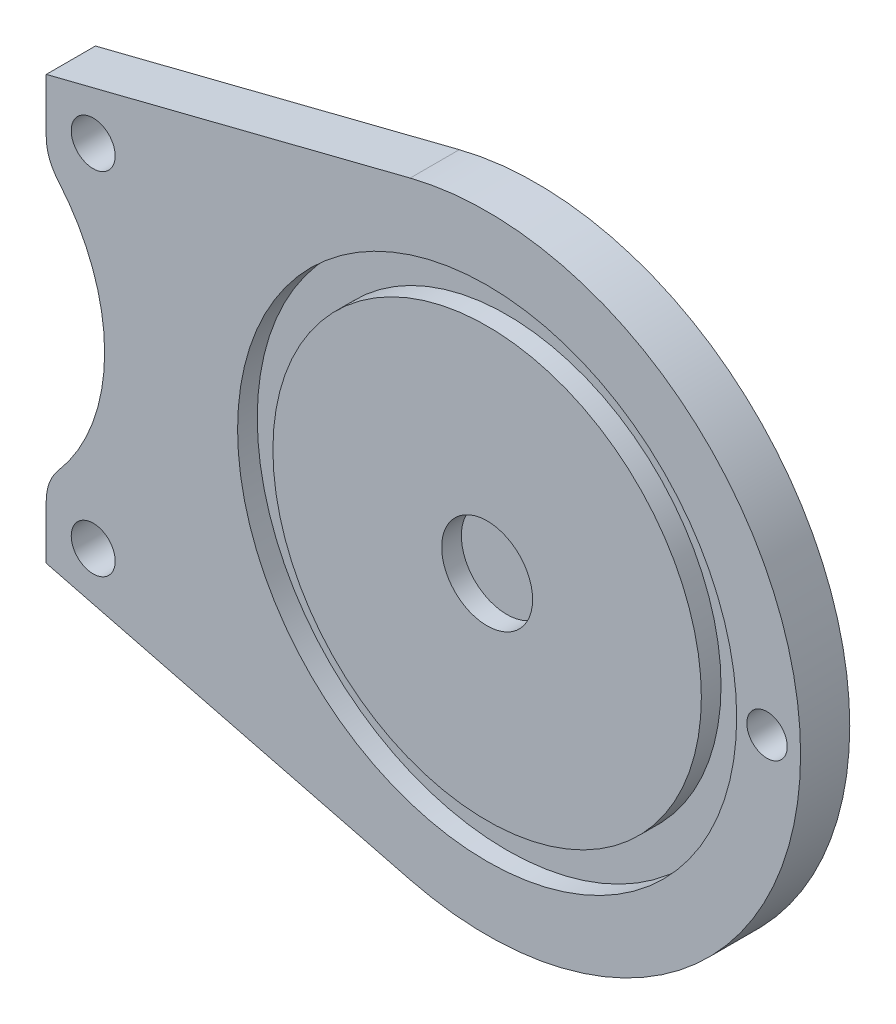
ISO-10303-21;
HEADER;
FILE_DESCRIPTION(('STEP AP214'),'2;1');
FILE_NAME('part.step','',(''),(''),'','','');
FILE_SCHEMA(('AUTOMOTIVE_DESIGN { 1 0 10303 214 1 1 1 1 }'));
ENDSEC;
DATA;
#1=APPLICATION_CONTEXT('core data for automotive mechanical design processes');
#2=APPLICATION_PROTOCOL_DEFINITION('international standard','automotive_design',2000,#1);
#3=PRODUCT_CONTEXT('',#1,'mechanical');
#4=PRODUCT('Part','Part','',(#3));
#5=PRODUCT_RELATED_PRODUCT_CATEGORY('part','',(#4));
#6=PRODUCT_DEFINITION_FORMATION('','',#4);
#7=PRODUCT_DEFINITION_CONTEXT('part definition',#1,'design');
#8=PRODUCT_DEFINITION('design','',#6,#7);
#9=PRODUCT_DEFINITION_SHAPE('','',#8);
#10=(LENGTH_UNIT() NAMED_UNIT(*) SI_UNIT(.MILLI.,.METRE.));
#11=(NAMED_UNIT(*) PLANE_ANGLE_UNIT() SI_UNIT($,.RADIAN.));
#12=(NAMED_UNIT(*) SI_UNIT($,.STERADIAN.) SOLID_ANGLE_UNIT());
#13=UNCERTAINTY_MEASURE_WITH_UNIT(LENGTH_MEASURE(1.E-05),#10,'distance_accuracy_value','');
#14=(GEOMETRIC_REPRESENTATION_CONTEXT(3) GLOBAL_UNCERTAINTY_ASSIGNED_CONTEXT((#13)) GLOBAL_UNIT_ASSIGNED_CONTEXT((#10,
#11,#12)) REPRESENTATION_CONTEXT('',''));
#15=CARTESIAN_POINT('',(0.,0.,0.));
#16=DIRECTION('',(0.,0.,1.));
#17=DIRECTION('',(1.,0.,0.));
#18=AXIS2_PLACEMENT_3D('',#15,#16,#17);
#19=CARTESIAN_POINT('',(-116.955092631489,0.,10.));
#20=DIRECTION('',(0.,0.,-1.));
#21=DIRECTION('',(-1.,0.,0.));
#22=AXIS2_PLACEMENT_3D('',#19,#20,#21);
#23=CYLINDRICAL_SURFACE('',#22,39.1723652081648);
#24=CARTESIAN_POINT('',(-116.955092631489,0.,0.));
#25=DIRECTION('',(0.,0.,1.));
#26=DIRECTION('',(1.,0.,0.));
#27=AXIS2_PLACEMENT_3D('',#24,#25,#26);
#28=CIRCLE('',#27,39.1723652081648);
#29=CARTESIAN_POINT('',(-87.2428113055523,-25.5275250349552,0.));
#30=VERTEX_POINT('',#29);
#31=CARTESIAN_POINT('',(-87.2428113055524,25.5275250349552,0.));
#32=VERTEX_POINT('',#31);
#33=EDGE_CURVE('E151',#30,#32,#28,.T.);
#34=ORIENTED_EDGE('',*,*,#33,.F.);
#35=DIRECTION('',(0.,0.,-1.));
#36=VECTOR('',#35,1.);
#37=CARTESIAN_POINT('',(-87.2428113055523,-25.5275250349552,10.));
#38=LINE('',#37,#36);
#39=CARTESIAN_POINT('',(-87.2428113055523,-25.5275250349552,10.));
#40=VERTEX_POINT('',#39);
#41=EDGE_CURVE('E12',#40,#30,#38,.T.);
#42=ORIENTED_EDGE('',*,*,#41,.F.);
#43=CARTESIAN_POINT('',(-116.955092631489,0.,10.));
#44=DIRECTION('',(0.,0.,1.));
#45=DIRECTION('',(1.,0.,0.));
#46=AXIS2_PLACEMENT_3D('',#43,#44,#45);
#47=CIRCLE('',#46,39.1723652081648);
#48=CARTESIAN_POINT('',(-87.2428113055524,25.5275250349552,10.));
#49=VERTEX_POINT('',#48);
#50=EDGE_CURVE('E170',#40,#49,#47,.T.);
#51=ORIENTED_EDGE('',*,*,#50,.T.);
#52=DIRECTION('',(0.,0.,-1.));
#53=VECTOR('',#52,1.);
#54=CARTESIAN_POINT('',(-87.2428113055524,25.5275250349552,10.));
#55=LINE('',#54,#53);
#56=EDGE_CURVE('E72',#49,#32,#55,.T.);
#57=ORIENTED_EDGE('',*,*,#56,.T.);
#58=EDGE_LOOP('',(#34,#42,#51,#57));
#59=FACE_BOUND('',#58,.T.);
#60=ADVANCED_FACE('F56',(#59),#23,.F.);
#61=CARTESIAN_POINT('',(-79.6578005031555,-32.0442428535755,10.));
#62=DIRECTION('',(0.,0.,-1.));
#63=DIRECTION('',(-1.,0.,0.));
#64=AXIS2_PLACEMENT_3D('',#61,#62,#63);
#65=CYLINDRICAL_SURFACE('',#64,10.);
#66=CARTESIAN_POINT('',(-79.6578005031555,-32.0442428535755,0.));
#67=DIRECTION('',(0.,0.,1.));
#68=DIRECTION('',(1.,0.,0.));
#69=AXIS2_PLACEMENT_3D('',#66,#67,#68);
#70=CIRCLE('',#69,10.);
#71=CARTESIAN_POINT('',(-89.6578005031556,-32.0442428535755,0.));
#72=VERTEX_POINT('',#71);
#73=EDGE_CURVE('E153',#30,#72,#70,.T.);
#74=ORIENTED_EDGE('',*,*,#73,.T.);
#75=DIRECTION('',(0.,0.,-1.));
#76=VECTOR('',#75,1.);
#77=CARTESIAN_POINT('',(-89.6578005031556,-32.0442428535755,10.));
#78=LINE('',#77,#76);
#79=CARTESIAN_POINT('',(-89.6578005031556,-32.0442428535755,10.));
#80=VERTEX_POINT('',#79);
#81=EDGE_CURVE('E64',#80,#72,#78,.T.);
#82=ORIENTED_EDGE('',*,*,#81,.F.);
#83=CARTESIAN_POINT('',(-79.6578005031555,-32.0442428535755,10.));
#84=DIRECTION('',(0.,0.,1.));
#85=DIRECTION('',(1.,0.,0.));
#86=AXIS2_PLACEMENT_3D('',#83,#84,#85);
#87=CIRCLE('',#86,10.);
#88=EDGE_CURVE('E196',#40,#80,#87,.T.);
#89=ORIENTED_EDGE('',*,*,#88,.F.);
#90=ORIENTED_EDGE('',*,*,#41,.T.);
#91=EDGE_LOOP('',(#74,#82,#89,#90));
#92=FACE_BOUND('',#91,.T.);
#93=ADVANCED_FACE('F284',(#92),#65,.T.);
#94=CARTESIAN_POINT('',(-89.6578005031556,0.,10.));
#95=DIRECTION('',(1.,0.,0.));
#96=DIRECTION('',(0.,0.,-1.));
#97=AXIS2_PLACEMENT_3D('',#94,#95,#96);
#98=PLANE('',#97);
#99=DIRECTION('',(0.,-1.,0.));
#100=VECTOR('',#99,1.);
#101=CARTESIAN_POINT('',(-89.6578005031556,0.,0.));
#102=LINE('',#101,#100);
#103=CARTESIAN_POINT('',(-89.6578005031556,-43.0443252960603,0.));
#104=VERTEX_POINT('',#103);
#105=EDGE_CURVE('E156',#72,#104,#102,.T.);
#106=ORIENTED_EDGE('',*,*,#105,.T.);
#107=DIRECTION('',(0.,0.,-1.));
#108=VECTOR('',#107,1.);
#109=CARTESIAN_POINT('',(-89.6578005031556,-43.0443252960603,10.));
#110=LINE('',#109,#108);
#111=CARTESIAN_POINT('',(-89.6578005031556,-43.0443252960603,10.));
#112=VERTEX_POINT('',#111);
#113=EDGE_CURVE('E176',#112,#104,#110,.T.);
#114=ORIENTED_EDGE('',*,*,#113,.F.);
#115=DIRECTION('',(0.,-1.,0.));
#116=VECTOR('',#115,1.);
#117=CARTESIAN_POINT('',(-89.6578005031556,0.,10.));
#118=LINE('',#117,#116);
#119=EDGE_CURVE('E184',#80,#112,#118,.T.);
#120=ORIENTED_EDGE('',*,*,#119,.F.);
#121=ORIENTED_EDGE('',*,*,#81,.T.);
#122=EDGE_LOOP('',(#106,#114,#120,#121));
#123=FACE_BOUND('',#122,.T.);
#124=ADVANCED_FACE('F182',(#123),#98,.F.);
#125=CARTESIAN_POINT('',(-15.6520550730121,-61.7905806482469,10.));
#126=DIRECTION('',(-0.245552639035149,-0.969383258295125,0.));
#127=DIRECTION('',(0.969383258295126,-0.245552639035149,0.));
#128=AXIS2_PLACEMENT_3D('',#125,#126,#127);
#129=PLANE('',#128);
#130=DIRECTION('',(-0.969383258295126,0.245552639035149,0.));
#131=VECTOR('',#130,1.);
#132=CARTESIAN_POINT('',(-15.6520550730121,-61.7905806482469,0.));
#133=LINE('',#132,#131);
#134=CARTESIAN_POINT('',(-15.6520550730121,-61.7905806482469,0.));
#135=VERTEX_POINT('',#134);
#136=EDGE_CURVE('E159',#135,#104,#133,.T.);
#137=ORIENTED_EDGE('',*,*,#136,.F.);
#138=DIRECTION('',(0.,0.,-1.));
#139=VECTOR('',#138,1.);
#140=CARTESIAN_POINT('',(-15.6520550730121,-61.7905806482469,10.));
#141=LINE('',#140,#139);
#142=CARTESIAN_POINT('',(-15.6520550730121,-61.7905806482469,10.));
#143=VERTEX_POINT('',#142);
#144=EDGE_CURVE('E174',#143,#135,#141,.T.);
#145=ORIENTED_EDGE('',*,*,#144,.F.);
#146=DIRECTION('',(-0.969383258295126,0.245552639035149,0.));
#147=VECTOR('',#146,1.);
#148=CARTESIAN_POINT('',(-15.6520550730121,-61.7905806482469,10.));
#149=LINE('',#148,#147);
#150=EDGE_CURVE('E194',#143,#112,#149,.T.);
#151=ORIENTED_EDGE('',*,*,#150,.T.);
#152=ORIENTED_EDGE('',*,*,#113,.T.);
#153=EDGE_LOOP('',(#137,#145,#151,#152));
#154=FACE_BOUND('',#153,.T.);
#155=ADVANCED_FACE('F192',(#154),#129,.T.);
#156=CARTESIAN_POINT('',(0.,0.,10.));
#157=DIRECTION('',(0.,0.,-1.));
#158=DIRECTION('',(-1.,0.,0.));
#159=AXIS2_PLACEMENT_3D('',#156,#157,#158);
#160=CYLINDRICAL_SURFACE('',#159,63.742157830247);
#161=CARTESIAN_POINT('',(0.,0.,0.));
#162=DIRECTION('',(0.,0.,1.));
#163=DIRECTION('',(1.,0.,0.));
#164=AXIS2_PLACEMENT_3D('',#161,#162,#163);
#165=CIRCLE('',#164,63.742157830247);
#166=CARTESIAN_POINT('',(-15.6520550730121,61.7905806482469,0.));
#167=VERTEX_POINT('',#166);
#168=EDGE_CURVE('E162',#135,#167,#165,.T.);
#169=ORIENTED_EDGE('',*,*,#168,.T.);
#170=DIRECTION('',(0.,0.,-1.));
#171=VECTOR('',#170,1.);
#172=CARTESIAN_POINT('',(-15.6520550730121,61.7905806482469,10.));
#173=LINE('',#172,#171);
#174=CARTESIAN_POINT('',(-15.6520550730121,61.7905806482469,10.));
#175=VERTEX_POINT('',#174);
#176=EDGE_CURVE('E143',#175,#167,#173,.T.);
#177=ORIENTED_EDGE('',*,*,#176,.F.);
#178=CARTESIAN_POINT('',(0.,0.,10.));
#179=DIRECTION('',(0.,0.,1.));
#180=DIRECTION('',(1.,0.,0.));
#181=AXIS2_PLACEMENT_3D('',#178,#179,#180);
#182=CIRCLE('',#181,63.742157830247);
#183=EDGE_CURVE('E131',#143,#175,#182,.T.);
#184=ORIENTED_EDGE('',*,*,#183,.F.);
#185=ORIENTED_EDGE('',*,*,#144,.T.);
#186=EDGE_LOOP('',(#169,#177,#184,#185));
#187=FACE_BOUND('',#186,.T.);
#188=ADVANCED_FACE('F295',(#187),#160,.T.);
#189=CARTESIAN_POINT('',(-15.6520550730121,61.7905806482469,10.));
#190=DIRECTION('',(0.245552639035149,-0.969383258295125,0.));
#191=DIRECTION('',(0.969383258295126,0.245552639035149,0.));
#192=AXIS2_PLACEMENT_3D('',#189,#190,#191);
#193=PLANE('',#192);
#194=DIRECTION('',(-0.969383258295126,-0.245552639035149,0.));
#195=VECTOR('',#194,1.);
#196=CARTESIAN_POINT('',(-15.6520550730121,61.7905806482469,0.));
#197=LINE('',#196,#195);
#198=CARTESIAN_POINT('',(-89.6578005031556,43.0443252960603,0.));
#199=VERTEX_POINT('',#198);
#200=EDGE_CURVE('E140',#167,#199,#197,.T.);
#201=ORIENTED_EDGE('',*,*,#200,.T.);
#202=DIRECTION('',(0.,0.,-1.));
#203=VECTOR('',#202,1.);
#204=CARTESIAN_POINT('',(-89.6578005031556,43.0443252960603,10.));
#205=LINE('',#204,#203);
#206=CARTESIAN_POINT('',(-89.6578005031556,43.0443252960603,10.));
#207=VERTEX_POINT('',#206);
#208=EDGE_CURVE('E137',#207,#199,#205,.T.);
#209=ORIENTED_EDGE('',*,*,#208,.F.);
#210=DIRECTION('',(-0.969383258295126,-0.245552639035149,0.));
#211=VECTOR('',#210,1.);
#212=CARTESIAN_POINT('',(-15.6520550730121,61.7905806482469,10.));
#213=LINE('',#212,#211);
#214=EDGE_CURVE('E122',#175,#207,#213,.T.);
#215=ORIENTED_EDGE('',*,*,#214,.F.);
#216=ORIENTED_EDGE('',*,*,#176,.T.);
#217=EDGE_LOOP('',(#201,#209,#215,#216));
#218=FACE_BOUND('',#217,.T.);
#219=ADVANCED_FACE('F138',(#218),#193,.F.);
#220=CARTESIAN_POINT('',(-89.6578005031556,0.,10.));
#221=DIRECTION('',(1.,0.,0.));
#222=DIRECTION('',(0.,0.,-1.));
#223=AXIS2_PLACEMENT_3D('',#220,#221,#222);
#224=PLANE('',#223);
#225=DIRECTION('',(0.,-1.,0.));
#226=VECTOR('',#225,1.);
#227=CARTESIAN_POINT('',(-89.6578005031556,0.,0.));
#228=LINE('',#227,#226);
#229=CARTESIAN_POINT('',(-89.6578005031556,32.0442428535756,0.));
#230=VERTEX_POINT('',#229);
#231=EDGE_CURVE('E165',#199,#230,#228,.T.);
#232=ORIENTED_EDGE('',*,*,#231,.T.);
#233=DIRECTION('',(0.,0.,-1.));
#234=VECTOR('',#233,1.);
#235=CARTESIAN_POINT('',(-89.6578005031556,32.0442428535756,10.));
#236=LINE('',#235,#234);
#237=CARTESIAN_POINT('',(-89.6578005031556,32.0442428535756,10.));
#238=VERTEX_POINT('',#237);
#239=EDGE_CURVE('E98',#238,#230,#236,.T.);
#240=ORIENTED_EDGE('',*,*,#239,.F.);
#241=DIRECTION('',(0.,-1.,0.));
#242=VECTOR('',#241,1.);
#243=CARTESIAN_POINT('',(-89.6578005031556,0.,10.));
#244=LINE('',#243,#242);
#245=EDGE_CURVE('E128',#207,#238,#244,.T.);
#246=ORIENTED_EDGE('',*,*,#245,.F.);
#247=ORIENTED_EDGE('',*,*,#208,.T.);
#248=EDGE_LOOP('',(#232,#240,#246,#247));
#249=FACE_BOUND('',#248,.T.);
#250=ADVANCED_FACE('F145',(#249),#224,.F.);
#251=CARTESIAN_POINT('',(-79.6578005031556,32.0442428535756,10.));
#252=DIRECTION('',(0.,0.,-1.));
#253=DIRECTION('',(-1.,0.,0.));
#254=AXIS2_PLACEMENT_3D('',#251,#252,#253);
#255=CYLINDRICAL_SURFACE('',#254,9.99999999999999);
#256=CARTESIAN_POINT('',(-79.6578005031556,32.0442428535756,0.));
#257=DIRECTION('',(0.,0.,1.));
#258=DIRECTION('',(1.,0.,0.));
#259=AXIS2_PLACEMENT_3D('',#256,#257,#258);
#260=CIRCLE('',#259,9.99999999999999);
#261=EDGE_CURVE('E167',#32,#230,#260,.F.);
#262=ORIENTED_EDGE('',*,*,#261,.F.);
#263=ORIENTED_EDGE('',*,*,#56,.F.);
#264=CARTESIAN_POINT('',(-79.6578005031556,32.0442428535756,10.));
#265=DIRECTION('',(0.,0.,1.));
#266=DIRECTION('',(1.,0.,0.));
#267=AXIS2_PLACEMENT_3D('',#264,#265,#266);
#268=CIRCLE('',#267,9.99999999999999);
#269=EDGE_CURVE('E146',#49,#238,#268,.F.);
#270=ORIENTED_EDGE('',*,*,#269,.T.);
#271=ORIENTED_EDGE('',*,*,#239,.T.);
#272=EDGE_LOOP('',(#262,#263,#270,#271));
#273=FACE_BOUND('',#272,.T.);
#274=ADVANCED_FACE('F269',(#273),#255,.T.);
#275=CARTESIAN_POINT('',(0.,0.,10.));
#276=DIRECTION('',(0.,0.,1.));
#277=DIRECTION('',(1.,0.,0.));
#278=AXIS2_PLACEMENT_3D('',#275,#276,#277);
#279=PLANE('',#278);
#280=CARTESIAN_POINT('',(0.,0.,10.));
#281=DIRECTION('',(0.,0.,1.));
#282=DIRECTION('',(1.,0.,0.));
#283=AXIS2_PLACEMENT_3D('',#280,#281,#282);
#284=CIRCLE('',#283,50.7472098303788);
#285=CARTESIAN_POINT('',(50.7472098303788,0.,10.));
#286=VERTEX_POINT('',#285);
#287=EDGE_CURVE('E219',#286,#286,#284,.T.);
#288=ORIENTED_EDGE('',*,*,#287,.F.);
#289=EDGE_LOOP('',(#288));
#290=FACE_BOUND('',#289,.T.);
#291=CARTESIAN_POINT('',(-80.1077075781025,35.6771309727541,10.));
#292=DIRECTION('',(0.,0.,1.));
#293=DIRECTION('',(1.,0.,0.));
#294=AXIS2_PLACEMENT_3D('',#291,#292,#293);
#295=CIRCLE('',#294,4.4689090740124);
#296=CARTESIAN_POINT('',(-75.6387985040901,35.6771309727541,10.));
#297=VERTEX_POINT('',#296);
#298=EDGE_CURVE('E214',#297,#297,#295,.T.);
#299=ORIENTED_EDGE('',*,*,#298,.F.);
#300=EDGE_LOOP('',(#299));
#301=FACE_BOUND('',#300,.T.);
#302=CARTESIAN_POINT('',(-80.1077075781025,-35.6771309727541,10.));
#303=DIRECTION('',(0.,0.,1.));
#304=DIRECTION('',(-1.,0.,0.));
#305=AXIS2_PLACEMENT_3D('',#302,#303,#304);
#306=CIRCLE('',#305,4.4689090740124);
#307=CARTESIAN_POINT('',(-84.5766166521149,-35.6771309727541,10.));
#308=VERTEX_POINT('',#307);
#309=EDGE_CURVE('E208',#308,#308,#306,.T.);
#310=ORIENTED_EDGE('',*,*,#309,.F.);
#311=EDGE_LOOP('',(#310));
#312=FACE_BOUND('',#311,.T.);
#313=CARTESIAN_POINT('',(56.9196791816466,0.,10.));
#314=DIRECTION('',(0.,0.,1.));
#315=DIRECTION('',(1.,0.,0.));
#316=AXIS2_PLACEMENT_3D('',#313,#314,#315);
#317=CIRCLE('',#316,4.1089682855471);
#318=CARTESIAN_POINT('',(61.0286474671937,0.,10.));
#319=VERTEX_POINT('',#318);
#320=EDGE_CURVE('E201',#319,#319,#317,.T.);
#321=ORIENTED_EDGE('',*,*,#320,.F.);
#322=EDGE_LOOP('',(#321));
#323=FACE_BOUND('',#322,.T.);
#324=ORIENTED_EDGE('',*,*,#50,.F.);
#325=ORIENTED_EDGE('',*,*,#88,.T.);
#326=ORIENTED_EDGE('',*,*,#119,.T.);
#327=ORIENTED_EDGE('',*,*,#150,.F.);
#328=ORIENTED_EDGE('',*,*,#183,.T.);
#329=ORIENTED_EDGE('',*,*,#214,.T.);
#330=ORIENTED_EDGE('',*,*,#245,.T.);
#331=ORIENTED_EDGE('',*,*,#269,.F.);
#332=EDGE_LOOP('',(#324,#325,#326,#327,#328,#329,#330,#331));
#333=FACE_BOUND('',#332,.T.);
#334=ADVANCED_FACE('F125',(#290,#301,#312,#323,#333),#279,.T.);
#335=CARTESIAN_POINT('',(0.,0.,0.));
#336=DIRECTION('',(0.,0.,1.));
#337=DIRECTION('',(1.,0.,0.));
#338=AXIS2_PLACEMENT_3D('',#335,#336,#337);
#339=PLANE('',#338);
#340=CARTESIAN_POINT('',(0.,0.,0.));
#341=DIRECTION('',(0.,0.,-1.));
#342=DIRECTION('',(-1.,0.,0.));
#343=AXIS2_PLACEMENT_3D('',#340,#341,#342);
#344=CIRCLE('',#343,18.2013189972718);
#345=CARTESIAN_POINT('',(-18.2013189972718,0.,0.));
#346=VERTEX_POINT('',#345);
#347=EDGE_CURVE('E237',#346,#346,#344,.T.);
#348=ORIENTED_EDGE('',*,*,#347,.F.);
#349=EDGE_LOOP('',(#348));
#350=FACE_BOUND('',#349,.T.);
#351=CARTESIAN_POINT('',(-80.1077075781025,35.6771309727541,0.));
#352=DIRECTION('',(0.,0.,1.));
#353=DIRECTION('',(1.,0.,0.));
#354=AXIS2_PLACEMENT_3D('',#351,#352,#353);
#355=CIRCLE('',#354,4.4689090740124);
#356=CARTESIAN_POINT('',(-75.6387985040901,35.6771309727541,0.));
#357=VERTEX_POINT('',#356);
#358=EDGE_CURVE('E154',#357,#357,#355,.T.);
#359=ORIENTED_EDGE('',*,*,#358,.T.);
#360=EDGE_LOOP('',(#359));
#361=FACE_BOUND('',#360,.T.);
#362=CARTESIAN_POINT('',(-80.1077075781025,-35.6771309727541,0.));
#363=DIRECTION('',(0.,0.,1.));
#364=DIRECTION('',(-1.,0.,0.));
#365=AXIS2_PLACEMENT_3D('',#362,#363,#364);
#366=CIRCLE('',#365,4.4689090740124);
#367=CARTESIAN_POINT('',(-84.5766166521149,-35.6771309727541,0.));
#368=VERTEX_POINT('',#367);
#369=EDGE_CURVE('E211',#368,#368,#366,.T.);
#370=ORIENTED_EDGE('',*,*,#369,.T.);
#371=EDGE_LOOP('',(#370));
#372=FACE_BOUND('',#371,.T.);
#373=CARTESIAN_POINT('',(56.9196791816466,0.,0.));
#374=DIRECTION('',(0.,0.,1.));
#375=DIRECTION('',(1.,0.,0.));
#376=AXIS2_PLACEMENT_3D('',#373,#374,#375);
#377=CIRCLE('',#376,4.1089682855471);
#378=CARTESIAN_POINT('',(61.0286474671937,0.,0.));
#379=VERTEX_POINT('',#378);
#380=EDGE_CURVE('E204',#379,#379,#377,.T.);
#381=ORIENTED_EDGE('',*,*,#380,.T.);
#382=EDGE_LOOP('',(#381));
#383=FACE_BOUND('',#382,.T.);
#384=ORIENTED_EDGE('',*,*,#33,.T.);
#385=ORIENTED_EDGE('',*,*,#261,.T.);
#386=ORIENTED_EDGE('',*,*,#231,.F.);
#387=ORIENTED_EDGE('',*,*,#200,.F.);
#388=ORIENTED_EDGE('',*,*,#168,.F.);
#389=ORIENTED_EDGE('',*,*,#136,.T.);
#390=ORIENTED_EDGE('',*,*,#105,.F.);
#391=ORIENTED_EDGE('',*,*,#73,.F.);
#392=EDGE_LOOP('',(#384,#385,#386,#387,#388,#389,#390,#391));
#393=FACE_BOUND('',#392,.T.);
#394=ADVANCED_FACE('F188',(#350,#361,#372,#383,#393),#339,.F.);
#395=CARTESIAN_POINT('',(56.9196791816466,0.,0.));
#396=DIRECTION('',(0.,0.,1.));
#397=DIRECTION('',(1.,0.,0.));
#398=AXIS2_PLACEMENT_3D('',#395,#396,#397);
#399=CYLINDRICAL_SURFACE('',#398,4.1089682855471);
#400=ORIENTED_EDGE('',*,*,#380,.F.);
#401=EDGE_LOOP('',(#400));
#402=FACE_BOUND('',#401,.T.);
#403=ORIENTED_EDGE('',*,*,#320,.T.);
#404=EDGE_LOOP('',(#403));
#405=FACE_BOUND('',#404,.T.);
#406=ADVANCED_FACE('F254',(#402,#405),#399,.F.);
#407=CARTESIAN_POINT('',(-80.1077075781025,-35.6771309727541,0.));
#408=DIRECTION('',(0.,0.,1.));
#409=DIRECTION('',(1.,0.,0.));
#410=AXIS2_PLACEMENT_3D('',#407,#408,#409);
#411=CYLINDRICAL_SURFACE('',#410,4.4689090740124);
#412=ORIENTED_EDGE('',*,*,#369,.F.);
#413=EDGE_LOOP('',(#412));
#414=FACE_BOUND('',#413,.T.);
#415=ORIENTED_EDGE('',*,*,#309,.T.);
#416=EDGE_LOOP('',(#415));
#417=FACE_BOUND('',#416,.T.);
#418=ADVANCED_FACE('F264',(#414,#417),#411,.F.);
#419=CARTESIAN_POINT('',(-80.1077075781025,35.6771309727541,0.));
#420=DIRECTION('',(0.,0.,1.));
#421=DIRECTION('',(1.,0.,0.));
#422=AXIS2_PLACEMENT_3D('',#419,#420,#421);
#423=CYLINDRICAL_SURFACE('',#422,4.4689090740124);
#424=ORIENTED_EDGE('',*,*,#358,.F.);
#425=EDGE_LOOP('',(#424));
#426=FACE_BOUND('',#425,.T.);
#427=ORIENTED_EDGE('',*,*,#298,.T.);
#428=EDGE_LOOP('',(#427));
#429=FACE_BOUND('',#428,.T.);
#430=ADVANCED_FACE('F327',(#426,#429),#423,.F.);
#431=CARTESIAN_POINT('',(0.,0.,6.00000000000001));
#432=DIRECTION('',(0.,0.,1.));
#433=DIRECTION('',(1.,0.,0.));
#434=AXIS2_PLACEMENT_3D('',#431,#432,#433);
#435=CYLINDRICAL_SURFACE('',#434,43.5655438704957);
#436=CARTESIAN_POINT('',(0.,0.,6.00000000000001));
#437=DIRECTION('',(0.,0.,1.));
#438=DIRECTION('',(1.,0.,0.));
#439=AXIS2_PLACEMENT_3D('',#436,#437,#438);
#440=CIRCLE('',#439,43.5655438704957);
#441=CARTESIAN_POINT('',(43.5655438704957,0.,6.00000000000001));
#442=VERTEX_POINT('',#441);
#443=EDGE_CURVE('E222',#442,#442,#440,.T.);
#444=ORIENTED_EDGE('',*,*,#443,.T.);
#445=EDGE_LOOP('',(#444));
#446=FACE_BOUND('',#445,.T.);
#447=CARTESIAN_POINT('',(0.,0.,10.));
#448=DIRECTION('',(0.,0.,1.));
#449=DIRECTION('',(1.,0.,0.));
#450=AXIS2_PLACEMENT_3D('',#447,#448,#449);
#451=CIRCLE('',#450,43.5655438704957);
#452=CARTESIAN_POINT('',(43.5655438704957,0.,10.));
#453=VERTEX_POINT('',#452);
#454=EDGE_CURVE('E223',#453,#453,#451,.T.);
#455=ORIENTED_EDGE('',*,*,#454,.F.);
#456=EDGE_LOOP('',(#455));
#457=FACE_BOUND('',#456,.T.);
#458=ADVANCED_FACE('F336',(#446,#457),#435,.T.);
#459=CARTESIAN_POINT('',(0.,0.,6.00000000000001));
#460=DIRECTION('',(0.,0.,1.));
#461=DIRECTION('',(1.,0.,0.));
#462=AXIS2_PLACEMENT_3D('',#459,#460,#461);
#463=CYLINDRICAL_SURFACE('',#462,50.7472098303788);
#464=CARTESIAN_POINT('',(0.,0.,6.00000000000001));
#465=DIRECTION('',(0.,0.,1.));
#466=DIRECTION('',(1.,0.,0.));
#467=AXIS2_PLACEMENT_3D('',#464,#465,#466);
#468=CIRCLE('',#467,50.7472098303788);
#469=CARTESIAN_POINT('',(50.7472098303788,0.,6.00000000000001));
#470=VERTEX_POINT('',#469);
#471=EDGE_CURVE('E205',#470,#470,#468,.T.);
#472=ORIENTED_EDGE('',*,*,#471,.F.);
#473=EDGE_LOOP('',(#472));
#474=FACE_BOUND('',#473,.T.);
#475=ORIENTED_EDGE('',*,*,#287,.T.);
#476=EDGE_LOOP('',(#475));
#477=FACE_BOUND('',#476,.T.);
#478=ADVANCED_FACE('F353',(#474,#477),#463,.F.);
#479=CARTESIAN_POINT('',(0.,0.,6.00000000000001));
#480=DIRECTION('',(0.,0.,1.));
#481=DIRECTION('',(1.,0.,0.));
#482=AXIS2_PLACEMENT_3D('',#479,#480,#481);
#483=PLANE('',#482);
#484=ORIENTED_EDGE('',*,*,#443,.F.);
#485=EDGE_LOOP('',(#484));
#486=FACE_BOUND('',#485,.T.);
#487=ORIENTED_EDGE('',*,*,#471,.T.);
#488=EDGE_LOOP('',(#487));
#489=FACE_BOUND('',#488,.T.);
#490=ADVANCED_FACE('F281',(#486,#489),#483,.T.);
#491=CARTESIAN_POINT('',(0.,0.,10.));
#492=DIRECTION('',(0.,0.,1.));
#493=DIRECTION('',(1.,0.,0.));
#494=AXIS2_PLACEMENT_3D('',#491,#492,#493);
#495=CIRCLE('',#494,9.24493496961201);
#496=CARTESIAN_POINT('',(9.24493496961201,0.,10.));
#497=VERTEX_POINT('',#496);
#498=EDGE_CURVE('E231',#497,#497,#495,.T.);
#499=ORIENTED_EDGE('',*,*,#498,.F.);
#500=EDGE_LOOP('',(#499));
#501=FACE_BOUND('',#500,.T.);
#502=ORIENTED_EDGE('',*,*,#454,.T.);
#503=EDGE_LOOP('',(#502));
#504=FACE_BOUND('',#503,.T.);
#505=ADVANCED_FACE('F272',(#501,#504),#279,.T.);
#506=CARTESIAN_POINT('',(0.,0.,6.00000000000001));
#507=DIRECTION('',(0.,0.,1.));
#508=DIRECTION('',(1.,0.,0.));
#509=AXIS2_PLACEMENT_3D('',#506,#507,#508);
#510=CYLINDRICAL_SURFACE('',#509,9.24493496961201);
#511=CARTESIAN_POINT('',(0.,0.,6.00000000000001));
#512=DIRECTION('',(0.,0.,1.));
#513=DIRECTION('',(1.,0.,0.));
#514=AXIS2_PLACEMENT_3D('',#511,#512,#513);
#515=CIRCLE('',#514,9.24493496961201);
#516=CARTESIAN_POINT('',(9.24493496961201,0.,6.00000000000001));
#517=VERTEX_POINT('',#516);
#518=EDGE_CURVE('E226',#517,#517,#515,.T.);
#519=ORIENTED_EDGE('',*,*,#518,.F.);
#520=EDGE_LOOP('',(#519));
#521=FACE_BOUND('',#520,.T.);
#522=ORIENTED_EDGE('',*,*,#498,.T.);
#523=EDGE_LOOP('',(#522));
#524=FACE_BOUND('',#523,.T.);
#525=ADVANCED_FACE('F280',(#521,#524),#510,.F.);
#526=CARTESIAN_POINT('',(0.,0.,6.00000000000001));
#527=DIRECTION('',(0.,0.,1.));
#528=DIRECTION('',(1.,0.,0.));
#529=AXIS2_PLACEMENT_3D('',#526,#527,#528);
#530=PLANE('',#529);
#531=ORIENTED_EDGE('',*,*,#518,.T.);
#532=EDGE_LOOP('',(#531));
#533=FACE_BOUND('',#532,.T.);
#534=ADVANCED_FACE('F248',(#533),#530,.T.);
#535=CARTESIAN_POINT('',(0.,0.,5.));
#536=DIRECTION('',(0.,0.,-1.));
#537=DIRECTION('',(-1.,0.,0.));
#538=AXIS2_PLACEMENT_3D('',#535,#536,#537);
#539=CYLINDRICAL_SURFACE('',#538,18.2013189972718);
#540=CARTESIAN_POINT('',(0.,0.,5.));
#541=DIRECTION('',(0.,0.,-1.));
#542=DIRECTION('',(-1.,0.,0.));
#543=AXIS2_PLACEMENT_3D('',#540,#541,#542);
#544=CIRCLE('',#543,18.2013189972718);
#545=CARTESIAN_POINT('',(-18.2013189972718,0.,5.));
#546=VERTEX_POINT('',#545);
#547=EDGE_CURVE('E234',#546,#546,#544,.T.);
#548=ORIENTED_EDGE('',*,*,#547,.F.);
#549=EDGE_LOOP('',(#548));
#550=FACE_BOUND('',#549,.T.);
#551=ORIENTED_EDGE('',*,*,#347,.T.);
#552=EDGE_LOOP('',(#551));
#553=FACE_BOUND('',#552,.T.);
#554=ADVANCED_FACE('F245',(#550,#553),#539,.F.);
#555=CARTESIAN_POINT('',(0.,0.,5.));
#556=DIRECTION('',(0.,0.,-1.));
#557=DIRECTION('',(-1.,0.,0.));
#558=AXIS2_PLACEMENT_3D('',#555,#556,#557);
#559=PLANE('',#558);
#560=ORIENTED_EDGE('',*,*,#547,.T.);
#561=EDGE_LOOP('',(#560));
#562=FACE_BOUND('',#561,.T.);
#563=ADVANCED_FACE('F243',(#562),#559,.T.);
#564=CLOSED_SHELL('',(#60,#93,#124,#155,#188,#219,#250,#274,#334,#394,#406,#418,#430,#458,#478,
#490,#505,#525,#534,#554,#563));
#565=MANIFOLD_SOLID_BREP('B2',#564);
#566=ADVANCED_BREP_SHAPE_REPRESENTATION('',(#18,#565),#14);
#567=SHAPE_DEFINITION_REPRESENTATION(#9,#566);
ENDSEC;
END-ISO-10303-21;
